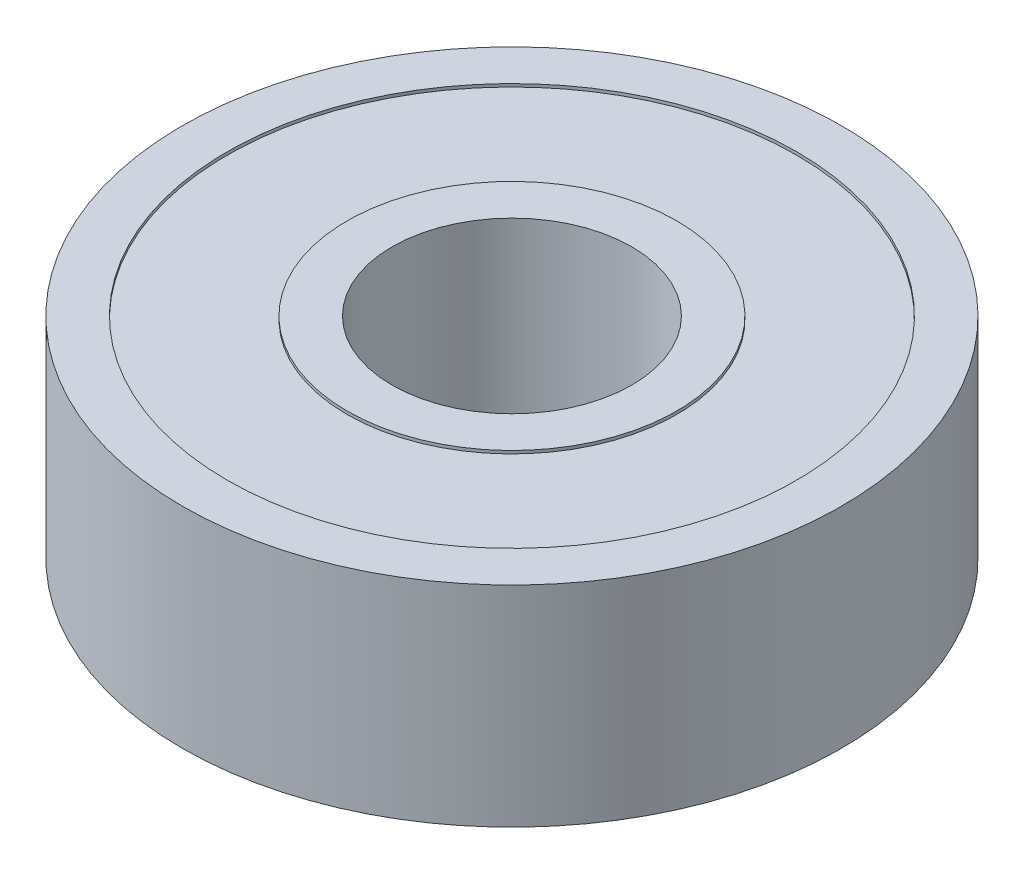
ISO-10303-21;
HEADER;
FILE_DESCRIPTION(('STEP AP214'),'2;1');
FILE_NAME('part.step','',(''),(''),'','','');
FILE_SCHEMA(('AUTOMOTIVE_DESIGN { 1 0 10303 214 1 1 1 1 }'));
ENDSEC;
DATA;
#1=APPLICATION_CONTEXT('core data for automotive mechanical design processes');
#2=APPLICATION_PROTOCOL_DEFINITION('international standard','automotive_design',2000,#1);
#3=PRODUCT_CONTEXT('',#1,'mechanical');
#4=PRODUCT('Part','Part','',(#3));
#5=PRODUCT_RELATED_PRODUCT_CATEGORY('part','',(#4));
#6=PRODUCT_DEFINITION_FORMATION('','',#4);
#7=PRODUCT_DEFINITION_CONTEXT('part definition',#1,'design');
#8=PRODUCT_DEFINITION('design','',#6,#7);
#9=PRODUCT_DEFINITION_SHAPE('','',#8);
#10=(LENGTH_UNIT() NAMED_UNIT(*) SI_UNIT(.MILLI.,.METRE.));
#11=(NAMED_UNIT(*) PLANE_ANGLE_UNIT() SI_UNIT($,.RADIAN.));
#12=(NAMED_UNIT(*) SI_UNIT($,.STERADIAN.) SOLID_ANGLE_UNIT());
#13=UNCERTAINTY_MEASURE_WITH_UNIT(LENGTH_MEASURE(1.E-05),#10,'distance_accuracy_value','');
#14=(GEOMETRIC_REPRESENTATION_CONTEXT(3) GLOBAL_UNCERTAINTY_ASSIGNED_CONTEXT((#13)) GLOBAL_UNIT_ASSIGNED_CONTEXT((#10,
#11,#12)) REPRESENTATION_CONTEXT('',''));
#15=CARTESIAN_POINT('',(0.,0.,0.));
#16=DIRECTION('',(0.,0.,1.));
#17=DIRECTION('',(1.,0.,0.));
#18=AXIS2_PLACEMENT_3D('',#15,#16,#17);
#19=CARTESIAN_POINT('',(0.,0.,0.));
#20=DIRECTION('',(0.,1.,0.));
#21=DIRECTION('',(0.,0.,0.999999999999996));
#22=AXIS2_PLACEMENT_3D('',#19,#20,#21);
#23=PLANE('',#22);
#24=CARTESIAN_POINT('',(0.,0.,0.));
#25=DIRECTION('',(0.,1.,0.));
#26=DIRECTION('',(0.,0.,0.999999999999996));
#27=AXIS2_PLACEMENT_3D('',#24,#25,#26);
#28=CIRCLE('',#27,4.);
#29=CARTESIAN_POINT('',(0.,0.,3.99999999999999));
#30=VERTEX_POINT('',#29);
#31=EDGE_CURVE('E69',#30,#30,#28,.T.);
#32=ORIENTED_EDGE('',*,*,#31,.T.);
#33=EDGE_LOOP('',(#32));
#34=FACE_BOUND('',#33,.T.);
#35=CARTESIAN_POINT('',(0.,0.,0.));
#36=DIRECTION('',(0.,-1.,0.));
#37=DIRECTION('',(0.,0.,-0.999999999999996));
#38=AXIS2_PLACEMENT_3D('',#35,#36,#37);
#39=CIRCLE('',#38,5.5);
#40=CARTESIAN_POINT('',(0.,0.,-5.49999999999998));
#41=VERTEX_POINT('',#40);
#42=EDGE_CURVE('E105',#41,#41,#39,.T.);
#43=ORIENTED_EDGE('',*,*,#42,.T.);
#44=EDGE_LOOP('',(#43));
#45=FACE_BOUND('',#44,.T.);
#46=ADVANCED_FACE('F51',(#34,#45),#23,.F.);
#47=CARTESIAN_POINT('',(0.,6.99999999999999,0.));
#48=DIRECTION('',(0.,1.,0.));
#49=DIRECTION('',(0.,0.,0.999999999999996));
#50=AXIS2_PLACEMENT_3D('',#47,#48,#49);
#51=PLANE('',#50);
#52=CARTESIAN_POINT('',(0.,6.99999999999999,0.));
#53=DIRECTION('',(0.,1.,0.));
#54=DIRECTION('',(0.,0.,0.999999999999996));
#55=AXIS2_PLACEMENT_3D('',#52,#53,#54);
#56=CIRCLE('',#55,4.);
#57=CARTESIAN_POINT('',(0.,6.99999999999998,3.99999999999999));
#58=VERTEX_POINT('',#57);
#59=EDGE_CURVE('E60',#58,#58,#56,.T.);
#60=ORIENTED_EDGE('',*,*,#59,.F.);
#61=EDGE_LOOP('',(#60));
#62=FACE_BOUND('',#61,.T.);
#63=CARTESIAN_POINT('',(0.,6.99999999999999,0.));
#64=DIRECTION('',(0.,1.,0.));
#65=DIRECTION('',(0.,0.,0.999999999999996));
#66=AXIS2_PLACEMENT_3D('',#63,#64,#65);
#67=CIRCLE('',#66,5.5);
#68=CARTESIAN_POINT('',(0.,6.99999999999997,5.49999999999998));
#69=VERTEX_POINT('',#68);
#70=EDGE_CURVE('E89',#69,#69,#67,.T.);
#71=ORIENTED_EDGE('',*,*,#70,.T.);
#72=EDGE_LOOP('',(#71));
#73=FACE_BOUND('',#72,.T.);
#74=ADVANCED_FACE('F147',(#62,#73),#51,.T.);
#75=CARTESIAN_POINT('',(0.,6.99999999999999,0.));
#76=DIRECTION('',(0.,-1.,0.));
#77=DIRECTION('',(0.,0.,-0.999999999999996));
#78=AXIS2_PLACEMENT_3D('',#75,#76,#77);
#79=CYLINDRICAL_SURFACE('',#78,4.);
#80=ORIENTED_EDGE('',*,*,#59,.T.);
#81=EDGE_LOOP('',(#80));
#82=FACE_BOUND('',#81,.T.);
#83=ORIENTED_EDGE('',*,*,#31,.F.);
#84=EDGE_LOOP('',(#83));
#85=FACE_BOUND('',#84,.T.);
#86=ADVANCED_FACE('F53',(#82,#85),#79,.F.);
#87=CARTESIAN_POINT('',(0.,6.99999999999999,0.));
#88=DIRECTION('',(0.,-1.,0.));
#89=DIRECTION('',(0.,0.,-0.999999999999996));
#90=AXIS2_PLACEMENT_3D('',#87,#88,#89);
#91=CYLINDRICAL_SURFACE('',#90,11.);
#92=CARTESIAN_POINT('',(0.,6.99999999999999,0.));
#93=DIRECTION('',(0.,1.,0.));
#94=DIRECTION('',(0.,0.,0.999999999999996));
#95=AXIS2_PLACEMENT_3D('',#92,#93,#94);
#96=CIRCLE('',#95,11.);
#97=CARTESIAN_POINT('',(0.,6.99999999999995,11.));
#98=VERTEX_POINT('',#97);
#99=EDGE_CURVE('E10',#98,#98,#96,.T.);
#100=ORIENTED_EDGE('',*,*,#99,.F.);
#101=EDGE_LOOP('',(#100));
#102=FACE_BOUND('',#101,.T.);
#103=CARTESIAN_POINT('',(0.,0.,0.));
#104=DIRECTION('',(0.,1.,0.));
#105=DIRECTION('',(0.,0.,0.999999999999996));
#106=AXIS2_PLACEMENT_3D('',#103,#104,#105);
#107=CIRCLE('',#106,11.);
#108=CARTESIAN_POINT('',(0.,0.,11.));
#109=VERTEX_POINT('',#108);
#110=EDGE_CURVE('E55',#109,#109,#107,.T.);
#111=ORIENTED_EDGE('',*,*,#110,.T.);
#112=EDGE_LOOP('',(#111));
#113=FACE_BOUND('',#112,.T.);
#114=ADVANCED_FACE('F138',(#102,#113),#91,.T.);
#115=CARTESIAN_POINT('',(0.,6.99999999999999,0.));
#116=DIRECTION('',(0.,1.,0.));
#117=DIRECTION('',(0.,0.,0.999999999999996));
#118=AXIS2_PLACEMENT_3D('',#115,#116,#117);
#119=CIRCLE('',#118,9.5);
#120=CARTESIAN_POINT('',(0.,6.99999999999996,9.49999999999996));
#121=VERTEX_POINT('',#120);
#122=EDGE_CURVE('E80',#121,#121,#119,.T.);
#123=ORIENTED_EDGE('',*,*,#122,.F.);
#124=EDGE_LOOP('',(#123));
#125=FACE_BOUND('',#124,.T.);
#126=ORIENTED_EDGE('',*,*,#99,.T.);
#127=EDGE_LOOP('',(#126));
#128=FACE_BOUND('',#127,.T.);
#129=ADVANCED_FACE('F134',(#125,#128),#51,.T.);
#130=CARTESIAN_POINT('',(0.,0.,0.));
#131=DIRECTION('',(0.,-1.,0.));
#132=DIRECTION('',(0.,0.,-0.999999999999996));
#133=AXIS2_PLACEMENT_3D('',#130,#131,#132);
#134=CIRCLE('',#133,9.5);
#135=CARTESIAN_POINT('',(0.,0.,-9.49999999999996));
#136=VERTEX_POINT('',#135);
#137=EDGE_CURVE('E97',#136,#136,#134,.T.);
#138=ORIENTED_EDGE('',*,*,#137,.F.);
#139=EDGE_LOOP('',(#138));
#140=FACE_BOUND('',#139,.T.);
#141=ORIENTED_EDGE('',*,*,#110,.F.);
#142=EDGE_LOOP('',(#141));
#143=FACE_BOUND('',#142,.T.);
#144=ADVANCED_FACE('F130',(#140,#143),#23,.F.);
#145=CARTESIAN_POINT('',(0.,6.9,0.));
#146=DIRECTION('',(0.,1.,0.));
#147=DIRECTION('',(0.,0.,0.999999999999996));
#148=AXIS2_PLACEMENT_3D('',#145,#146,#147);
#149=CYLINDRICAL_SURFACE('',#148,9.5);
#150=CARTESIAN_POINT('',(0.,6.9,0.));
#151=DIRECTION('',(0.,1.,0.));
#152=DIRECTION('',(0.,0.,0.999999999999996));
#153=AXIS2_PLACEMENT_3D('',#150,#151,#152);
#154=CIRCLE('',#153,9.5);
#155=CARTESIAN_POINT('',(0.,6.89999999999997,9.49999999999996));
#156=VERTEX_POINT('',#155);
#157=EDGE_CURVE('E72',#156,#156,#154,.T.);
#158=ORIENTED_EDGE('',*,*,#157,.F.);
#159=EDGE_LOOP('',(#158));
#160=FACE_BOUND('',#159,.T.);
#161=ORIENTED_EDGE('',*,*,#122,.T.);
#162=EDGE_LOOP('',(#161));
#163=FACE_BOUND('',#162,.T.);
#164=ADVANCED_FACE('F133',(#160,#163),#149,.F.);
#165=CARTESIAN_POINT('',(0.,6.9,0.));
#166=DIRECTION('',(0.,1.,0.));
#167=DIRECTION('',(0.,0.,0.999999999999996));
#168=AXIS2_PLACEMENT_3D('',#165,#166,#167);
#169=PLANE('',#168);
#170=CARTESIAN_POINT('',(0.,6.9,0.));
#171=DIRECTION('',(0.,1.,0.));
#172=DIRECTION('',(0.,0.,0.999999999999996));
#173=AXIS2_PLACEMENT_3D('',#170,#171,#172);
#174=CIRCLE('',#173,5.5);
#175=CARTESIAN_POINT('',(0.,6.89999999999998,5.49999999999998));
#176=VERTEX_POINT('',#175);
#177=EDGE_CURVE('E87',#176,#176,#174,.T.);
#178=ORIENTED_EDGE('',*,*,#177,.F.);
#179=EDGE_LOOP('',(#178));
#180=FACE_BOUND('',#179,.T.);
#181=ORIENTED_EDGE('',*,*,#157,.T.);
#182=EDGE_LOOP('',(#181));
#183=FACE_BOUND('',#182,.T.);
#184=ADVANCED_FACE('F158',(#180,#183),#169,.T.);
#185=CARTESIAN_POINT('',(0.,6.9,0.));
#186=DIRECTION('',(0.,1.,0.));
#187=DIRECTION('',(0.,0.,0.999999999999996));
#188=AXIS2_PLACEMENT_3D('',#185,#186,#187);
#189=CYLINDRICAL_SURFACE('',#188,5.5);
#190=ORIENTED_EDGE('',*,*,#177,.T.);
#191=EDGE_LOOP('',(#190));
#192=FACE_BOUND('',#191,.T.);
#193=ORIENTED_EDGE('',*,*,#70,.F.);
#194=EDGE_LOOP('',(#193));
#195=FACE_BOUND('',#194,.T.);
#196=ADVANCED_FACE('F126',(#192,#195),#189,.T.);
#197=CARTESIAN_POINT('',(0.,0.100000000000003,0.));
#198=DIRECTION('',(0.,-1.,0.));
#199=DIRECTION('',(0.,0.,-0.999999999999996));
#200=AXIS2_PLACEMENT_3D('',#197,#198,#199);
#201=CYLINDRICAL_SURFACE('',#200,9.5);
#202=CARTESIAN_POINT('',(0.,0.100000000000003,0.));
#203=DIRECTION('',(0.,-1.,0.));
#204=DIRECTION('',(0.,0.,-0.999999999999996));
#205=AXIS2_PLACEMENT_3D('',#202,#203,#204);
#206=CIRCLE('',#205,9.5);
#207=CARTESIAN_POINT('',(0.,0.100000000000038,-9.49999999999996));
#208=VERTEX_POINT('',#207);
#209=EDGE_CURVE('E93',#208,#208,#206,.T.);
#210=ORIENTED_EDGE('',*,*,#209,.F.);
#211=EDGE_LOOP('',(#210));
#212=FACE_BOUND('',#211,.T.);
#213=ORIENTED_EDGE('',*,*,#137,.T.);
#214=EDGE_LOOP('',(#213));
#215=FACE_BOUND('',#214,.T.);
#216=ADVANCED_FACE('F120',(#212,#215),#201,.F.);
#217=CARTESIAN_POINT('',(0.,0.100000000000003,0.));
#218=DIRECTION('',(0.,-1.,0.));
#219=DIRECTION('',(0.,0.,-0.999999999999996));
#220=AXIS2_PLACEMENT_3D('',#217,#218,#219);
#221=PLANE('',#220);
#222=CARTESIAN_POINT('',(0.,0.100000000000003,0.));
#223=DIRECTION('',(0.,-1.,0.));
#224=DIRECTION('',(0.,0.,-0.999999999999996));
#225=AXIS2_PLACEMENT_3D('',#222,#223,#224);
#226=CIRCLE('',#225,5.5);
#227=CARTESIAN_POINT('',(0.,0.100000000000023,-5.49999999999998));
#228=VERTEX_POINT('',#227);
#229=EDGE_CURVE('E101',#228,#228,#226,.T.);
#230=ORIENTED_EDGE('',*,*,#229,.F.);
#231=EDGE_LOOP('',(#230));
#232=FACE_BOUND('',#231,.T.);
#233=ORIENTED_EDGE('',*,*,#209,.T.);
#234=EDGE_LOOP('',(#233));
#235=FACE_BOUND('',#234,.T.);
#236=ADVANCED_FACE('F117',(#232,#235),#221,.T.);
#237=CARTESIAN_POINT('',(0.,0.100000000000003,0.));
#238=DIRECTION('',(0.,-1.,0.));
#239=DIRECTION('',(0.,0.,-0.999999999999996));
#240=AXIS2_PLACEMENT_3D('',#237,#238,#239);
#241=CYLINDRICAL_SURFACE('',#240,5.5);
#242=ORIENTED_EDGE('',*,*,#229,.T.);
#243=EDGE_LOOP('',(#242));
#244=FACE_BOUND('',#243,.T.);
#245=ORIENTED_EDGE('',*,*,#42,.F.);
#246=EDGE_LOOP('',(#245));
#247=FACE_BOUND('',#246,.T.);
#248=ADVANCED_FACE('F114',(#244,#247),#241,.T.);
#249=CLOSED_SHELL('',(#46,#74,#86,#114,#129,#144,#164,#184,#196,#216,#236,#248));
#250=MANIFOLD_SOLID_BREP('B2',#249);
#251=ADVANCED_BREP_SHAPE_REPRESENTATION('',(#18,#250),#14);
#252=SHAPE_DEFINITION_REPRESENTATION(#9,#251);
ENDSEC;
END-ISO-10303-21;
